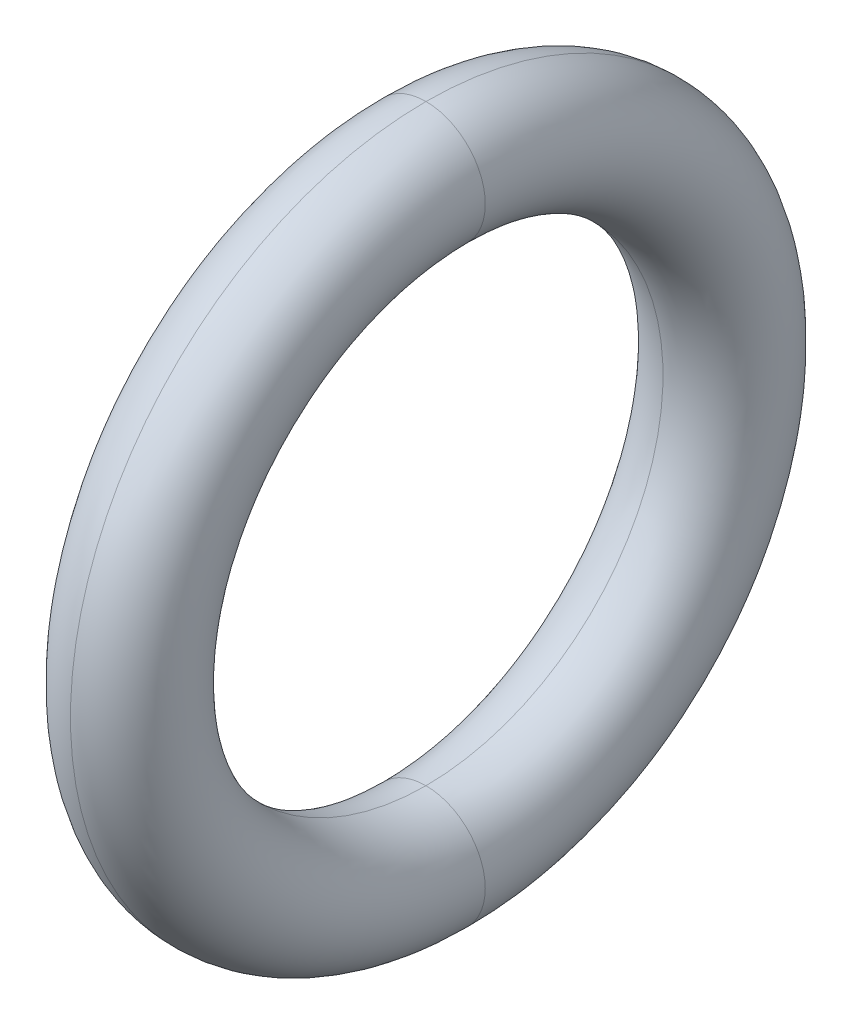
ISO-10303-21;
HEADER;
FILE_DESCRIPTION(('STEP AP214'),'2;1');
FILE_NAME('part.step','',(''),(''),'','','');
FILE_SCHEMA(('AUTOMOTIVE_DESIGN { 1 0 10303 214 1 1 1 1 }'));
ENDSEC;
DATA;
#1=APPLICATION_CONTEXT('core data for automotive mechanical design processes');
#2=APPLICATION_PROTOCOL_DEFINITION('international standard','automotive_design',2000,#1);
#3=PRODUCT_CONTEXT('',#1,'mechanical');
#4=PRODUCT('Part','Part','',(#3));
#5=PRODUCT_RELATED_PRODUCT_CATEGORY('part','',(#4));
#6=PRODUCT_DEFINITION_FORMATION('','',#4);
#7=PRODUCT_DEFINITION_CONTEXT('part definition',#1,'design');
#8=PRODUCT_DEFINITION('design','',#6,#7);
#9=PRODUCT_DEFINITION_SHAPE('','',#8);
#10=(LENGTH_UNIT() NAMED_UNIT(*) SI_UNIT(.MILLI.,.METRE.));
#11=(NAMED_UNIT(*) PLANE_ANGLE_UNIT() SI_UNIT($,.RADIAN.));
#12=(NAMED_UNIT(*) SI_UNIT($,.STERADIAN.) SOLID_ANGLE_UNIT());
#13=UNCERTAINTY_MEASURE_WITH_UNIT(LENGTH_MEASURE(1.E-05),#10,'distance_accuracy_value','');
#14=(GEOMETRIC_REPRESENTATION_CONTEXT(3) GLOBAL_UNCERTAINTY_ASSIGNED_CONTEXT((#13)) GLOBAL_UNIT_ASSIGNED_CONTEXT((#10,
#11,#12)) REPRESENTATION_CONTEXT('',''));
#15=CARTESIAN_POINT('',(0.,0.,0.));
#16=DIRECTION('',(0.,0.,1.));
#17=DIRECTION('',(1.,0.,0.));
#18=AXIS2_PLACEMENT_3D('',#15,#16,#17);
#19=CARTESIAN_POINT('',(-9.,0.,0.));
#20=DIRECTION('',(1.,0.,0.));
#21=DIRECTION('',(0.,1.,0.));
#22=AXIS2_PLACEMENT_3D('',#19,#20,#21);
#23=TOROIDAL_SURFACE('',#22,5.,1.);
#24=CARTESIAN_POINT('',(-9.,-5.,0.));
#25=DIRECTION('',(0.,0.,1.));
#26=DIRECTION('',(0.,-1.,0.));
#27=AXIS2_PLACEMENT_3D('',#24,#25,#26);
#28=CIRCLE('',#27,1.);
#29=CARTESIAN_POINT('',(-9.,-6.,0.));
#30=VERTEX_POINT('',#29);
#31=CARTESIAN_POINT('',(-9.,-4.,0.));
#32=VERTEX_POINT('',#31);
#33=EDGE_CURVE('E10',#30,#32,#28,.T.);
#34=ORIENTED_EDGE('',*,*,#33,.F.);
#35=CARTESIAN_POINT('',(-9.,0.,0.));
#36=DIRECTION('',(1.,0.,0.));
#37=DIRECTION('',(0.,1.,0.));
#38=AXIS2_PLACEMENT_3D('',#35,#36,#37);
#39=CIRCLE('',#38,6.);
#40=CARTESIAN_POINT('',(-9.,6.,0.));
#41=VERTEX_POINT('',#40);
#42=EDGE_CURVE('E55',#30,#41,#39,.T.);
#43=ORIENTED_EDGE('',*,*,#42,.T.);
#44=CARTESIAN_POINT('',(-9.,5.,0.));
#45=DIRECTION('',(0.,0.,-1.));
#46=DIRECTION('',(-1.,0.,0.));
#47=AXIS2_PLACEMENT_3D('',#44,#45,#46);
#48=CIRCLE('',#47,1.);
#49=CARTESIAN_POINT('',(-9.,4.,0.));
#50=VERTEX_POINT('',#49);
#51=EDGE_CURVE('E27',#41,#50,#48,.T.);
#52=ORIENTED_EDGE('',*,*,#51,.T.);
#53=CARTESIAN_POINT('',(-9.,0.,0.));
#54=DIRECTION('',(1.,0.,0.));
#55=DIRECTION('',(0.,1.,0.));
#56=AXIS2_PLACEMENT_3D('',#53,#54,#55);
#57=CIRCLE('',#56,4.);
#58=EDGE_CURVE('E57',#32,#50,#57,.T.);
#59=ORIENTED_EDGE('',*,*,#58,.F.);
#60=EDGE_LOOP('',(#34,#43,#52,#59));
#61=FACE_BOUND('',#60,.T.);
#62=ADVANCED_FACE('F16',(#61),#23,.T.);
#63=CARTESIAN_POINT('',(-9.,0.,0.));
#64=DIRECTION('',(1.,0.,0.));
#65=DIRECTION('',(0.,1.,0.));
#66=AXIS2_PLACEMENT_3D('',#63,#64,#65);
#67=TOROIDAL_SURFACE('',#66,5.,1.);
#68=ORIENTED_EDGE('',*,*,#51,.F.);
#69=CARTESIAN_POINT('',(-9.,0.,0.));
#70=DIRECTION('',(1.,0.,0.));
#71=DIRECTION('',(0.,1.,0.));
#72=AXIS2_PLACEMENT_3D('',#69,#70,#71);
#73=CIRCLE('',#72,6.);
#74=EDGE_CURVE('E60',#41,#30,#73,.T.);
#75=ORIENTED_EDGE('',*,*,#74,.T.);
#76=ORIENTED_EDGE('',*,*,#33,.T.);
#77=CARTESIAN_POINT('',(-9.,0.,0.));
#78=DIRECTION('',(1.,0.,0.));
#79=DIRECTION('',(0.,1.,0.));
#80=AXIS2_PLACEMENT_3D('',#77,#78,#79);
#81=CIRCLE('',#80,4.);
#82=EDGE_CURVE('E66',#50,#32,#81,.T.);
#83=ORIENTED_EDGE('',*,*,#82,.F.);
#84=EDGE_LOOP('',(#68,#75,#76,#83));
#85=FACE_BOUND('',#84,.T.);
#86=ADVANCED_FACE('F18',(#85),#67,.T.);
#87=CARTESIAN_POINT('',(-9.,0.,0.));
#88=DIRECTION('',(1.,0.,0.));
#89=DIRECTION('',(0.,1.,0.));
#90=AXIS2_PLACEMENT_3D('',#87,#88,#89);
#91=TOROIDAL_SURFACE('',#90,5.,1.);
#92=ORIENTED_EDGE('',*,*,#74,.F.);
#93=CARTESIAN_POINT('',(-9.,5.,0.));
#94=DIRECTION('',(0.,0.,-1.));
#95=DIRECTION('',(-1.,0.,0.));
#96=AXIS2_PLACEMENT_3D('',#93,#94,#95);
#97=CIRCLE('',#96,1.);
#98=EDGE_CURVE('E20',#50,#41,#97,.T.);
#99=ORIENTED_EDGE('',*,*,#98,.F.);
#100=ORIENTED_EDGE('',*,*,#82,.T.);
#101=CARTESIAN_POINT('',(-9.,-5.,0.));
#102=DIRECTION('',(0.,0.,1.));
#103=DIRECTION('',(0.,-1.,0.));
#104=AXIS2_PLACEMENT_3D('',#101,#102,#103);
#105=CIRCLE('',#104,1.);
#106=EDGE_CURVE('E68',#32,#30,#105,.T.);
#107=ORIENTED_EDGE('',*,*,#106,.T.);
#108=EDGE_LOOP('',(#92,#99,#100,#107));
#109=FACE_BOUND('',#108,.T.);
#110=ADVANCED_FACE('F69',(#109),#91,.T.);
#111=CARTESIAN_POINT('',(-9.,0.,0.));
#112=DIRECTION('',(1.,0.,0.));
#113=DIRECTION('',(0.,1.,0.));
#114=AXIS2_PLACEMENT_3D('',#111,#112,#113);
#115=TOROIDAL_SURFACE('',#114,5.,1.);
#116=ORIENTED_EDGE('',*,*,#42,.F.);
#117=ORIENTED_EDGE('',*,*,#106,.F.);
#118=ORIENTED_EDGE('',*,*,#58,.T.);
#119=ORIENTED_EDGE('',*,*,#98,.T.);
#120=EDGE_LOOP('',(#116,#117,#118,#119));
#121=FACE_BOUND('',#120,.T.);
#122=ADVANCED_FACE('F73',(#121),#115,.T.);
#123=CLOSED_SHELL('',(#62,#86,#110,#122));
#124=MANIFOLD_SOLID_BREP('B1',#123);
#125=ADVANCED_BREP_SHAPE_REPRESENTATION('',(#18,#124),#14);
#126=SHAPE_DEFINITION_REPRESENTATION(#9,#125);
ENDSEC;
END-ISO-10303-21;
